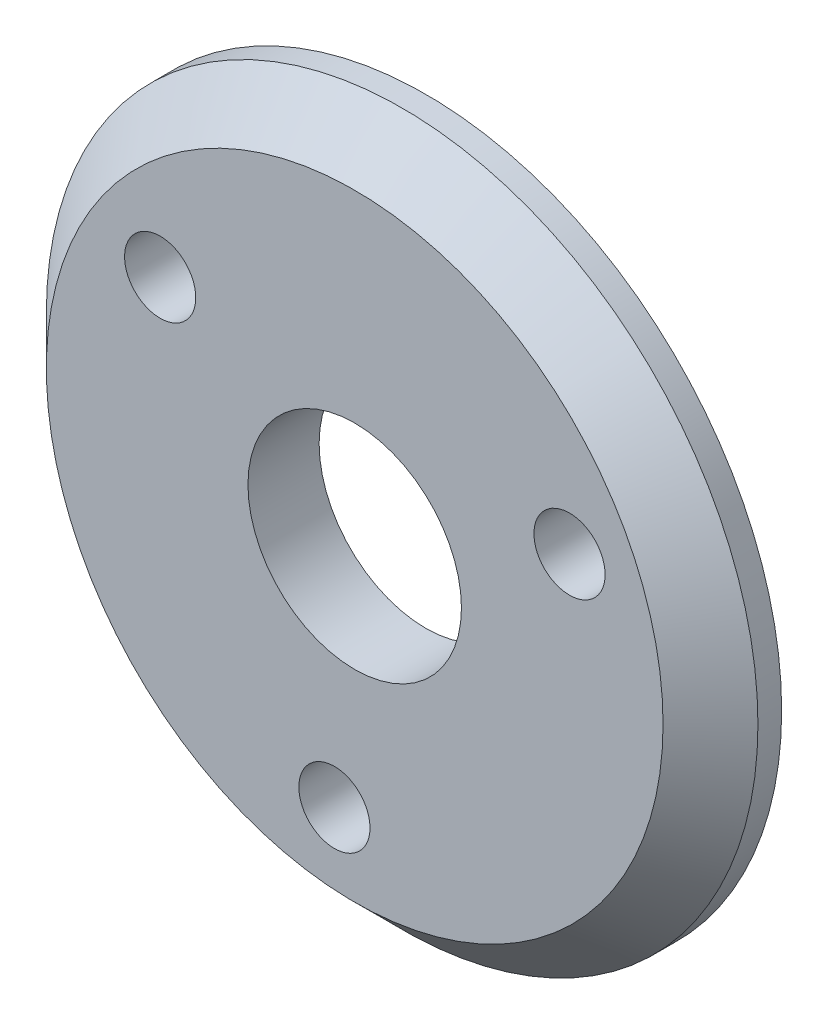
ISO-10303-21;
HEADER;
FILE_DESCRIPTION(('STEP AP214'),'2;1');
FILE_NAME('part.step','',(''),(''),'','','');
FILE_SCHEMA(('AUTOMOTIVE_DESIGN { 1 0 10303 214 1 1 1 1 }'));
ENDSEC;
DATA;
#1=APPLICATION_CONTEXT('core data for automotive mechanical design processes');
#2=APPLICATION_PROTOCOL_DEFINITION('international standard','automotive_design',2000,#1);
#3=PRODUCT_CONTEXT('',#1,'mechanical');
#4=PRODUCT('Part','Part','',(#3));
#5=PRODUCT_RELATED_PRODUCT_CATEGORY('part','',(#4));
#6=PRODUCT_DEFINITION_FORMATION('','',#4);
#7=PRODUCT_DEFINITION_CONTEXT('part definition',#1,'design');
#8=PRODUCT_DEFINITION('design','',#6,#7);
#9=PRODUCT_DEFINITION_SHAPE('','',#8);
#10=(LENGTH_UNIT() NAMED_UNIT(*) SI_UNIT(.MILLI.,.METRE.));
#11=(NAMED_UNIT(*) PLANE_ANGLE_UNIT() SI_UNIT($,.RADIAN.));
#12=(NAMED_UNIT(*) SI_UNIT($,.STERADIAN.) SOLID_ANGLE_UNIT());
#13=UNCERTAINTY_MEASURE_WITH_UNIT(LENGTH_MEASURE(1.E-05),#10,'distance_accuracy_value','');
#14=(GEOMETRIC_REPRESENTATION_CONTEXT(3) GLOBAL_UNCERTAINTY_ASSIGNED_CONTEXT((#13)) GLOBAL_UNIT_ASSIGNED_CONTEXT((#10,
#11,#12)) REPRESENTATION_CONTEXT('',''));
#15=CARTESIAN_POINT('',(0.,0.,0.));
#16=DIRECTION('',(0.,0.,1.));
#17=DIRECTION('',(1.,0.,0.));
#18=AXIS2_PLACEMENT_3D('',#15,#16,#17);
#19=CARTESIAN_POINT('',(0.,0.,3.));
#20=DIRECTION('',(0.,0.,1.));
#21=DIRECTION('',(1.,0.,0.));
#22=AXIS2_PLACEMENT_3D('',#19,#20,#21);
#23=PLANE('',#22);
#24=CARTESIAN_POINT('',(0.,0.,3.));
#25=DIRECTION('',(0.,0.,1.));
#26=DIRECTION('',(1.,0.,0.));
#27=AXIS2_PLACEMENT_3D('',#24,#25,#26);
#28=CIRCLE('',#27,13.);
#29=CARTESIAN_POINT('',(13.,0.,3.));
#30=VERTEX_POINT('',#29);
#31=EDGE_CURVE('E35',#30,#30,#28,.T.);
#32=ORIENTED_EDGE('',*,*,#31,.T.);
#33=EDGE_LOOP('',(#32));
#34=FACE_BOUND('',#33,.T.);
#35=CARTESIAN_POINT('',(9.05611823612466,4.24107562928679,3.));
#36=DIRECTION('',(0.,0.,1.));
#37=DIRECTION('',(1.,0.,0.));
#38=AXIS2_PLACEMENT_3D('',#35,#36,#37);
#39=CIRCLE('',#38,1.5);
#40=CARTESIAN_POINT('',(10.5561182361247,4.24107562928679,3.));
#41=VERTEX_POINT('',#40);
#42=EDGE_CURVE('E60',#41,#41,#39,.T.);
#43=ORIENTED_EDGE('',*,*,#42,.F.);
#44=EDGE_LOOP('',(#43));
#45=FACE_BOUND('',#44,.T.);
#46=CARTESIAN_POINT('',(0.,0.,3.));
#47=DIRECTION('',(0.,0.,1.));
#48=DIRECTION('',(1.,0.,0.));
#49=AXIS2_PLACEMENT_3D('',#46,#47,#48);
#50=CIRCLE('',#49,4.5);
#51=CARTESIAN_POINT('',(4.5,0.,3.));
#52=VERTEX_POINT('',#51);
#53=EDGE_CURVE('E43',#52,#52,#50,.T.);
#54=ORIENTED_EDGE('',*,*,#53,.F.);
#55=EDGE_LOOP('',(#54));
#56=FACE_BOUND('',#55,.T.);
#57=CARTESIAN_POINT('',(-8.20093835239579,5.72229063751605,3.));
#58=DIRECTION('',(0.,0.,1.));
#59=DIRECTION('',(1.,0.,0.));
#60=AXIS2_PLACEMENT_3D('',#57,#58,#59);
#61=CIRCLE('',#60,1.5);
#62=CARTESIAN_POINT('',(-6.70093835239579,5.72229063751605,3.));
#63=VERTEX_POINT('',#62);
#64=EDGE_CURVE('E54',#63,#63,#61,.T.);
#65=ORIENTED_EDGE('',*,*,#64,.F.);
#66=EDGE_LOOP('',(#65));
#67=FACE_BOUND('',#66,.T.);
#68=CARTESIAN_POINT('',(-0.855179883728945,-9.96336626680287,3.));
#69=DIRECTION('',(0.,0.,1.));
#70=DIRECTION('',(1.,0.,0.));
#71=AXIS2_PLACEMENT_3D('',#68,#69,#70);
#72=CIRCLE('',#71,1.5);
#73=CARTESIAN_POINT('',(0.644820116271055,-9.96336626680287,3.));
#74=VERTEX_POINT('',#73);
#75=EDGE_CURVE('E66',#74,#74,#72,.T.);
#76=ORIENTED_EDGE('',*,*,#75,.F.);
#77=EDGE_LOOP('',(#76));
#78=FACE_BOUND('',#77,.T.);
#79=ADVANCED_FACE('F28',(#34,#45,#56,#67,#78),#23,.T.);
#80=CARTESIAN_POINT('',(0.,0.,0.));
#81=DIRECTION('',(0.,0.,1.));
#82=DIRECTION('',(1.,0.,0.));
#83=AXIS2_PLACEMENT_3D('',#80,#81,#82);
#84=PLANE('',#83);
#85=CARTESIAN_POINT('',(9.05611823612466,4.24107562928679,0.));
#86=DIRECTION('',(0.,0.,1.));
#87=DIRECTION('',(1.,0.,0.));
#88=AXIS2_PLACEMENT_3D('',#85,#86,#87);
#89=CIRCLE('',#88,1.5);
#90=CARTESIAN_POINT('',(10.5561182361247,4.24107562928679,0.));
#91=VERTEX_POINT('',#90);
#92=EDGE_CURVE('E57',#91,#91,#89,.T.);
#93=ORIENTED_EDGE('',*,*,#92,.T.);
#94=EDGE_LOOP('',(#93));
#95=FACE_BOUND('',#94,.T.);
#96=CARTESIAN_POINT('',(0.,0.,0.));
#97=DIRECTION('',(0.,0.,1.));
#98=DIRECTION('',(1.,0.,0.));
#99=AXIS2_PLACEMENT_3D('',#96,#97,#98);
#100=CIRCLE('',#99,4.5);
#101=CARTESIAN_POINT('',(4.5,0.,0.));
#102=VERTEX_POINT('',#101);
#103=EDGE_CURVE('E48',#102,#102,#100,.T.);
#104=ORIENTED_EDGE('',*,*,#103,.T.);
#105=EDGE_LOOP('',(#104));
#106=FACE_BOUND('',#105,.T.);
#107=CARTESIAN_POINT('',(0.,0.,0.));
#108=DIRECTION('',(0.,0.,1.));
#109=DIRECTION('',(1.,0.,0.));
#110=AXIS2_PLACEMENT_3D('',#107,#108,#109);
#111=CIRCLE('',#110,15.);
#112=CARTESIAN_POINT('',(15.,0.,0.));
#113=VERTEX_POINT('',#112);
#114=EDGE_CURVE('E39',#113,#113,#111,.T.);
#115=ORIENTED_EDGE('',*,*,#114,.F.);
#116=EDGE_LOOP('',(#115));
#117=FACE_BOUND('',#116,.T.);
#118=CARTESIAN_POINT('',(-8.20093835239579,5.72229063751605,0.));
#119=DIRECTION('',(0.,0.,1.));
#120=DIRECTION('',(1.,0.,0.));
#121=AXIS2_PLACEMENT_3D('',#118,#119,#120);
#122=CIRCLE('',#121,1.5);
#123=CARTESIAN_POINT('',(-6.70093835239579,5.72229063751605,0.));
#124=VERTEX_POINT('',#123);
#125=EDGE_CURVE('E51',#124,#124,#122,.T.);
#126=ORIENTED_EDGE('',*,*,#125,.T.);
#127=EDGE_LOOP('',(#126));
#128=FACE_BOUND('',#127,.T.);
#129=CARTESIAN_POINT('',(-0.855179883728945,-9.96336626680287,0.));
#130=DIRECTION('',(0.,0.,1.));
#131=DIRECTION('',(1.,0.,0.));
#132=AXIS2_PLACEMENT_3D('',#129,#130,#131);
#133=CIRCLE('',#132,1.5);
#134=CARTESIAN_POINT('',(0.644820116271054,-9.96336626680287,0.));
#135=VERTEX_POINT('',#134);
#136=EDGE_CURVE('E63',#135,#135,#133,.T.);
#137=ORIENTED_EDGE('',*,*,#136,.T.);
#138=EDGE_LOOP('',(#137));
#139=FACE_BOUND('',#138,.T.);
#140=ADVANCED_FACE('F74',(#95,#106,#117,#128,#139),#84,.F.);
#141=CARTESIAN_POINT('',(0.,0.,3.));
#142=DIRECTION('',(0.,0.,-1.));
#143=DIRECTION('',(-1.,0.,0.));
#144=AXIS2_PLACEMENT_3D('',#141,#142,#143);
#145=CYLINDRICAL_SURFACE('',#144,15.);
#146=CARTESIAN_POINT('',(0.,0.,0.999999999999986));
#147=DIRECTION('',(0.,0.,1.));
#148=DIRECTION('',(1.,0.,0.));
#149=AXIS2_PLACEMENT_3D('',#146,#147,#148);
#150=CIRCLE('',#149,15.);
#151=CARTESIAN_POINT('',(15.,0.,0.999999999999986));
#152=VERTEX_POINT('',#151);
#153=EDGE_CURVE('E10',#152,#152,#150,.F.);
#154=ORIENTED_EDGE('',*,*,#153,.T.);
#155=EDGE_LOOP('',(#154));
#156=FACE_BOUND('',#155,.T.);
#157=ORIENTED_EDGE('',*,*,#114,.T.);
#158=EDGE_LOOP('',(#157));
#159=FACE_BOUND('',#158,.T.);
#160=ADVANCED_FACE('F30',(#156,#159),#145,.T.);
#161=CARTESIAN_POINT('',(0.,0.,3.));
#162=DIRECTION('',(0.,0.,-1.));
#163=DIRECTION('',(-1.,0.,0.));
#164=AXIS2_PLACEMENT_3D('',#161,#162,#163);
#165=CYLINDRICAL_SURFACE('',#164,4.5);
#166=ORIENTED_EDGE('',*,*,#53,.T.);
#167=EDGE_LOOP('',(#166));
#168=FACE_BOUND('',#167,.T.);
#169=ORIENTED_EDGE('',*,*,#103,.F.);
#170=EDGE_LOOP('',(#169));
#171=FACE_BOUND('',#170,.T.);
#172=ADVANCED_FACE('F82',(#168,#171),#165,.F.);
#173=CARTESIAN_POINT('',(-8.20093835239579,5.72229063751605,3.));
#174=DIRECTION('',(0.,0.,1.));
#175=DIRECTION('',(1.,0.,0.));
#176=AXIS2_PLACEMENT_3D('',#173,#174,#175);
#177=CYLINDRICAL_SURFACE('',#176,1.5);
#178=ORIENTED_EDGE('',*,*,#64,.T.);
#179=EDGE_LOOP('',(#178));
#180=FACE_BOUND('',#179,.T.);
#181=ORIENTED_EDGE('',*,*,#125,.F.);
#182=EDGE_LOOP('',(#181));
#183=FACE_BOUND('',#182,.T.);
#184=ADVANCED_FACE('F85',(#180,#183),#177,.F.);
#185=CARTESIAN_POINT('',(9.05611823612466,4.24107562928679,3.));
#186=DIRECTION('',(0.,0.,1.));
#187=DIRECTION('',(1.,0.,0.));
#188=AXIS2_PLACEMENT_3D('',#185,#186,#187);
#189=CYLINDRICAL_SURFACE('',#188,1.5);
#190=ORIENTED_EDGE('',*,*,#42,.T.);
#191=EDGE_LOOP('',(#190));
#192=FACE_BOUND('',#191,.T.);
#193=ORIENTED_EDGE('',*,*,#92,.F.);
#194=EDGE_LOOP('',(#193));
#195=FACE_BOUND('',#194,.T.);
#196=ADVANCED_FACE('F89',(#192,#195),#189,.F.);
#197=CARTESIAN_POINT('',(-0.855179883728945,-9.96336626680287,3.));
#198=DIRECTION('',(0.,0.,1.));
#199=DIRECTION('',(1.,0.,0.));
#200=AXIS2_PLACEMENT_3D('',#197,#198,#199);
#201=CYLINDRICAL_SURFACE('',#200,1.5);
#202=ORIENTED_EDGE('',*,*,#75,.T.);
#203=EDGE_LOOP('',(#202));
#204=FACE_BOUND('',#203,.T.);
#205=ORIENTED_EDGE('',*,*,#136,.F.);
#206=EDGE_LOOP('',(#205));
#207=FACE_BOUND('',#206,.T.);
#208=ADVANCED_FACE('F70',(#204,#207),#201,.F.);
#209=CARTESIAN_POINT('',(0.,0.,3.));
#210=DIRECTION('',(0.,0.,-1.));
#211=DIRECTION('',(-1.,0.,0.));
#212=AXIS2_PLACEMENT_3D('',#209,#210,#211);
#213=CONICAL_SURFACE('',#212,13.,0.785398163397453);
#214=ORIENTED_EDGE('',*,*,#153,.F.);
#215=EDGE_LOOP('',(#214));
#216=FACE_BOUND('',#215,.T.);
#217=ORIENTED_EDGE('',*,*,#31,.F.);
#218=EDGE_LOOP('',(#217));
#219=FACE_BOUND('',#218,.T.);
#220=ADVANCED_FACE('F96',(#216,#219),#213,.T.);
#221=CLOSED_SHELL('',(#79,#140,#160,#172,#184,#196,#208,#220));
#222=MANIFOLD_SOLID_BREP('B2',#221);
#223=ADVANCED_BREP_SHAPE_REPRESENTATION('',(#18,#222),#14);
#224=SHAPE_DEFINITION_REPRESENTATION(#9,#223);
ENDSEC;
END-ISO-10303-21;
